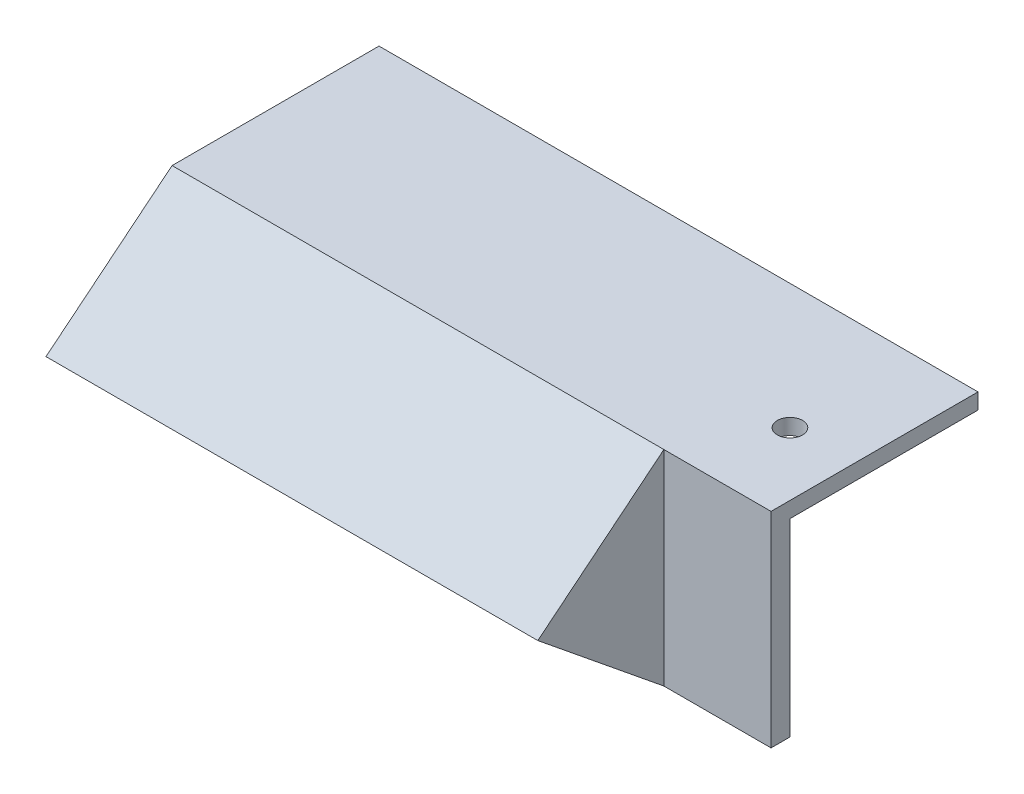
ISO-10303-21;
HEADER;
FILE_DESCRIPTION(('STEP AP214'),'2;1');
FILE_NAME('part.step','',(''),(''),'','','');
FILE_SCHEMA(('AUTOMOTIVE_DESIGN { 1 0 10303 214 1 1 1 1 }'));
ENDSEC;
DATA;
#1=APPLICATION_CONTEXT('core data for automotive mechanical design processes');
#2=APPLICATION_PROTOCOL_DEFINITION('international standard','automotive_design',2000,#1);
#3=PRODUCT_CONTEXT('',#1,'mechanical');
#4=PRODUCT('Part','Part','',(#3));
#5=PRODUCT_RELATED_PRODUCT_CATEGORY('part','',(#4));
#6=PRODUCT_DEFINITION_FORMATION('','',#4);
#7=PRODUCT_DEFINITION_CONTEXT('part definition',#1,'design');
#8=PRODUCT_DEFINITION('design','',#6,#7);
#9=PRODUCT_DEFINITION_SHAPE('','',#8);
#10=(LENGTH_UNIT() NAMED_UNIT(*) SI_UNIT(.MILLI.,.METRE.));
#11=(NAMED_UNIT(*) PLANE_ANGLE_UNIT() SI_UNIT($,.RADIAN.));
#12=(NAMED_UNIT(*) SI_UNIT($,.STERADIAN.) SOLID_ANGLE_UNIT());
#13=UNCERTAINTY_MEASURE_WITH_UNIT(LENGTH_MEASURE(1.E-05),#10,'distance_accuracy_value','');
#14=(GEOMETRIC_REPRESENTATION_CONTEXT(3) GLOBAL_UNCERTAINTY_ASSIGNED_CONTEXT((#13)) GLOBAL_UNIT_ASSIGNED_CONTEXT((#10,
#11,#12)) REPRESENTATION_CONTEXT('',''));
#15=CARTESIAN_POINT('',(0.,0.,0.));
#16=DIRECTION('',(0.,0.,1.));
#17=DIRECTION('',(1.,0.,0.));
#18=AXIS2_PLACEMENT_3D('',#15,#16,#17);
#19=CARTESIAN_POINT('',(0.,0.,91.));
#20=DIRECTION('',(0.,0.,1.));
#21=DIRECTION('',(1.,0.,0.));
#22=AXIS2_PLACEMENT_3D('',#19,#20,#21);
#23=PLANE('',#22);
#24=DIRECTION('',(0.,-1.,0.));
#25=VECTOR('',#24,1.);
#26=CARTESIAN_POINT('',(114.023739181458,-43.3,91.));
#27=LINE('',#26,#25);
#28=CARTESIAN_POINT('',(114.023739181458,-43.3,91.));
#29=VERTEX_POINT('',#28);
#30=CARTESIAN_POINT('',(114.023739181458,-45.8001,91.));
#31=VERTEX_POINT('',#30);
#32=EDGE_CURVE('E112',#29,#31,#27,.T.);
#33=ORIENTED_EDGE('',*,*,#32,.T.);
#34=DIRECTION('',(-1.,0.,0.));
#35=VECTOR('',#34,1.);
#36=CARTESIAN_POINT('',(0.,-45.8001,91.));
#37=LINE('',#36,#35);
#38=CARTESIAN_POINT('',(19.,-45.8001,91.));
#39=VERTEX_POINT('',#38);
#40=EDGE_CURVE('E142',#31,#39,#37,.T.);
#41=ORIENTED_EDGE('',*,*,#40,.T.);
#42=DIRECTION('',(0.,1.,0.));
#43=VECTOR('',#42,1.);
#44=CARTESIAN_POINT('',(19.,0.,91.));
#45=LINE('',#44,#43);
#46=CARTESIAN_POINT('',(19.,-43.3,91.));
#47=VERTEX_POINT('',#46);
#48=EDGE_CURVE('E39',#39,#47,#45,.T.);
#49=ORIENTED_EDGE('',*,*,#48,.T.);
#50=DIRECTION('',(-1.,0.,0.));
#51=VECTOR('',#50,1.);
#52=CARTESIAN_POINT('',(0.,-43.3,91.));
#53=LINE('',#52,#51);
#54=EDGE_CURVE('E108',#29,#47,#53,.T.);
#55=ORIENTED_EDGE('',*,*,#54,.F.);
#56=EDGE_LOOP('',(#33,#41,#49,#55));
#57=FACE_BOUND('',#56,.T.);
#58=ADVANCED_FACE('F35',(#57),#23,.F.);
#59=CARTESIAN_POINT('',(19.,0.,0.));
#60=DIRECTION('',(1.,0.,0.));
#61=DIRECTION('',(0.,0.,-1.));
#62=AXIS2_PLACEMENT_3D('',#59,#60,#61);
#63=PLANE('',#62);
#64=DIRECTION('',(0.,0.,1.));
#65=VECTOR('',#64,1.);
#66=CARTESIAN_POINT('',(19.,-45.8001,0.));
#67=LINE('',#66,#65);
#68=CARTESIAN_POINT('',(19.,-45.8001,120.831364888433));
#69=VERTEX_POINT('',#68);
#70=EDGE_CURVE('E141',#39,#69,#67,.T.);
#71=ORIENTED_EDGE('',*,*,#70,.T.);
#72=DIRECTION('',(0.,1.,0.));
#73=VECTOR('',#72,1.);
#74=CARTESIAN_POINT('',(19.,0.,120.831364888433));
#75=LINE('',#74,#73);
#76=CARTESIAN_POINT('',(19.,-75.8001,120.831364888433));
#77=VERTEX_POINT('',#76);
#78=EDGE_CURVE('E170',#77,#69,#75,.T.);
#79=ORIENTED_EDGE('',*,*,#78,.F.);
#80=DIRECTION('',(0.,0.,1.));
#81=VECTOR('',#80,1.);
#82=CARTESIAN_POINT('',(19.,-75.8001,123.831364888433));
#83=LINE('',#82,#81);
#84=CARTESIAN_POINT('',(19.,-75.8001,123.831364888433));
#85=VERTEX_POINT('',#84);
#86=EDGE_CURVE('E121',#77,#85,#83,.T.);
#87=ORIENTED_EDGE('',*,*,#86,.T.);
#88=DIRECTION('',(0.,-0.630593793828697,-0.776113050518241));
#89=VECTOR('',#88,1.);
#90=CARTESIAN_POINT('',(19.,-106.262866436039,86.3388446364474));
#91=LINE('',#90,#89);
#92=CARTESIAN_POINT('',(19.,-59.55005,143.831364888433));
#93=VERTEX_POINT('',#92);
#94=EDGE_CURVE('E119',#93,#85,#91,.T.);
#95=ORIENTED_EDGE('',*,*,#94,.F.);
#96=DIRECTION('',(0.,0.630593793828698,-0.776113050518241));
#97=VECTOR('',#96,1.);
#98=CARTESIAN_POINT('',(19.,-59.55005,143.831364888433));
#99=LINE('',#98,#97);
#100=CARTESIAN_POINT('',(19.,-43.3,123.831364888433));
#101=VERTEX_POINT('',#100);
#102=EDGE_CURVE('E115',#93,#101,#99,.T.);
#103=ORIENTED_EDGE('',*,*,#102,.T.);
#104=DIRECTION('',(0.,0.,1.));
#105=VECTOR('',#104,1.);
#106=CARTESIAN_POINT('',(19.,-43.3,0.));
#107=LINE('',#106,#105);
#108=EDGE_CURVE('E101',#47,#101,#107,.T.);
#109=ORIENTED_EDGE('',*,*,#108,.F.);
#110=ORIENTED_EDGE('',*,*,#48,.F.);
#111=EDGE_LOOP('',(#71,#79,#87,#95,#103,#109,#110));
#112=FACE_BOUND('',#111,.T.);
#113=ADVANCED_FACE('F117',(#112),#63,.F.);
#114=CARTESIAN_POINT('',(104.023739181458,-43.3,110.831364888433));
#115=DIRECTION('',(0.,-1.,0.));
#116=DIRECTION('',(0.,0.,-1.));
#117=AXIS2_PLACEMENT_3D('',#114,#115,#116);
#118=CYLINDRICAL_SURFACE('',#117,2.);
#119=CARTESIAN_POINT('',(104.023739181458,-43.3,110.831364888433));
#120=DIRECTION('',(0.,-1.,0.));
#121=DIRECTION('',(0.,0.,-1.));
#122=AXIS2_PLACEMENT_3D('',#119,#120,#121);
#123=CIRCLE('',#122,2.);
#124=CARTESIAN_POINT('',(104.023739181458,-43.3,108.831364888433));
#125=VERTEX_POINT('',#124);
#126=EDGE_CURVE('E139',#125,#125,#123,.T.);
#127=ORIENTED_EDGE('',*,*,#126,.F.);
#128=EDGE_LOOP('',(#127));
#129=FACE_BOUND('',#128,.T.);
#130=CARTESIAN_POINT('',(104.023739181458,-45.8001,110.831364888433));
#131=DIRECTION('',(0.,-1.,0.));
#132=DIRECTION('',(0.,0.,-1.));
#133=AXIS2_PLACEMENT_3D('',#130,#131,#132);
#134=CIRCLE('',#133,2.);
#135=CARTESIAN_POINT('',(104.023739181458,-45.8001,108.831364888433));
#136=VERTEX_POINT('',#135);
#137=EDGE_CURVE('E138',#136,#136,#134,.T.);
#138=ORIENTED_EDGE('',*,*,#137,.T.);
#139=EDGE_LOOP('',(#138));
#140=FACE_BOUND('',#139,.T.);
#141=ADVANCED_FACE('F208',(#129,#140),#118,.F.);
#142=CARTESIAN_POINT('',(0.,0.,123.831364888433));
#143=DIRECTION('',(0.,0.,1.));
#144=DIRECTION('',(1.,0.,0.));
#145=AXIS2_PLACEMENT_3D('',#142,#143,#144);
#146=PLANE('',#145);
#147=DIRECTION('',(0.,1.,0.));
#148=VECTOR('',#147,1.);
#149=CARTESIAN_POINT('',(97.0237391814581,-48.3,123.831364888433));
#150=LINE('',#149,#148);
#151=CARTESIAN_POINT('',(97.0237391814581,-75.8001,123.831364888433));
#152=VERTEX_POINT('',#151);
#153=CARTESIAN_POINT('',(97.0237391814581,-43.3,123.831364888433));
#154=VERTEX_POINT('',#153);
#155=EDGE_CURVE('E126',#152,#154,#150,.T.);
#156=ORIENTED_EDGE('',*,*,#155,.F.);
#157=DIRECTION('',(-1.,0.,0.));
#158=VECTOR('',#157,1.);
#159=CARTESIAN_POINT('',(0.,-75.8001,123.831364888433));
#160=LINE('',#159,#158);
#161=CARTESIAN_POINT('',(114.023739181458,-75.8001,123.831364888433));
#162=VERTEX_POINT('',#161);
#163=EDGE_CURVE('E154',#162,#152,#160,.T.);
#164=ORIENTED_EDGE('',*,*,#163,.F.);
#165=DIRECTION('',(0.,-1.,0.));
#166=VECTOR('',#165,1.);
#167=CARTESIAN_POINT('',(114.023739181458,0.,123.831364888433));
#168=LINE('',#167,#166);
#169=CARTESIAN_POINT('',(114.023739181458,-43.3,123.831364888433));
#170=VERTEX_POINT('',#169);
#171=EDGE_CURVE('E153',#170,#162,#168,.T.);
#172=ORIENTED_EDGE('',*,*,#171,.F.);
#173=DIRECTION('',(-1.,0.,0.));
#174=VECTOR('',#173,1.);
#175=CARTESIAN_POINT('',(0.,-43.3,123.831364888433));
#176=LINE('',#175,#174);
#177=EDGE_CURVE('E152',#170,#154,#176,.T.);
#178=ORIENTED_EDGE('',*,*,#177,.T.);
#179=EDGE_LOOP('',(#156,#164,#172,#178));
#180=FACE_BOUND('',#179,.T.);
#181=ADVANCED_FACE('F37',(#180),#146,.T.);
#182=CARTESIAN_POINT('',(114.023739181458,-43.3,0.));
#183=DIRECTION('',(1.,0.,0.));
#184=DIRECTION('',(0.,0.,-1.));
#185=AXIS2_PLACEMENT_3D('',#182,#183,#184);
#186=PLANE('',#185);
#187=ORIENTED_EDGE('',*,*,#32,.F.);
#188=DIRECTION('',(0.,0.,1.));
#189=VECTOR('',#188,1.);
#190=CARTESIAN_POINT('',(114.023739181458,-43.3,0.));
#191=LINE('',#190,#189);
#192=EDGE_CURVE('E136',#29,#170,#191,.T.);
#193=ORIENTED_EDGE('',*,*,#192,.T.);
#194=ORIENTED_EDGE('',*,*,#171,.T.);
#195=DIRECTION('',(0.,0.,-1.));
#196=VECTOR('',#195,1.);
#197=CARTESIAN_POINT('',(114.023739181458,-75.8001,123.831364888433));
#198=LINE('',#197,#196);
#199=CARTESIAN_POINT('',(114.023739181458,-75.8001,120.831364888433));
#200=VERTEX_POINT('',#199);
#201=EDGE_CURVE('E134',#162,#200,#198,.T.);
#202=ORIENTED_EDGE('',*,*,#201,.T.);
#203=DIRECTION('',(0.,-1.,0.));
#204=VECTOR('',#203,1.);
#205=CARTESIAN_POINT('',(114.023739181458,0.,120.831364888433));
#206=LINE('',#205,#204);
#207=CARTESIAN_POINT('',(114.023739181458,-45.8001,120.831364888433));
#208=VERTEX_POINT('',#207);
#209=EDGE_CURVE('E156',#208,#200,#206,.T.);
#210=ORIENTED_EDGE('',*,*,#209,.F.);
#211=DIRECTION('',(0.,0.,1.));
#212=VECTOR('',#211,1.);
#213=CARTESIAN_POINT('',(114.023739181458,-45.8001,0.));
#214=LINE('',#213,#212);
#215=EDGE_CURVE('E132',#31,#208,#214,.T.);
#216=ORIENTED_EDGE('',*,*,#215,.F.);
#217=EDGE_LOOP('',(#187,#193,#194,#202,#210,#216));
#218=FACE_BOUND('',#217,.T.);
#219=ADVANCED_FACE('F182',(#218),#186,.T.);
#220=CARTESIAN_POINT('',(0.,-45.8001,0.));
#221=DIRECTION('',(0.,-1.,0.));
#222=DIRECTION('',(0.,0.,-1.));
#223=AXIS2_PLACEMENT_3D('',#220,#221,#222);
#224=PLANE('',#223);
#225=ORIENTED_EDGE('',*,*,#70,.F.);
#226=ORIENTED_EDGE('',*,*,#40,.F.);
#227=ORIENTED_EDGE('',*,*,#215,.T.);
#228=DIRECTION('',(-1.,0.,0.));
#229=VECTOR('',#228,1.);
#230=CARTESIAN_POINT('',(0.,-45.8001,120.831364888433));
#231=LINE('',#230,#229);
#232=EDGE_CURVE('E135',#208,#69,#231,.T.);
#233=ORIENTED_EDGE('',*,*,#232,.T.);
#234=EDGE_LOOP('',(#225,#226,#227,#233));
#235=FACE_BOUND('',#234,.T.);
#236=ORIENTED_EDGE('',*,*,#137,.F.);
#237=EDGE_LOOP('',(#236));
#238=FACE_BOUND('',#237,.T.);
#239=ADVANCED_FACE('F188',(#235,#238),#224,.T.);
#240=CARTESIAN_POINT('',(0.,-43.3,0.));
#241=DIRECTION('',(0.,-1.,0.));
#242=DIRECTION('',(0.,0.,-1.));
#243=AXIS2_PLACEMENT_3D('',#240,#241,#242);
#244=PLANE('',#243);
#245=ORIENTED_EDGE('',*,*,#126,.T.);
#246=EDGE_LOOP('',(#245));
#247=FACE_BOUND('',#246,.T.);
#248=ORIENTED_EDGE('',*,*,#54,.T.);
#249=ORIENTED_EDGE('',*,*,#108,.T.);
#250=DIRECTION('',(-1.,0.,0.));
#251=VECTOR('',#250,1.);
#252=CARTESIAN_POINT('',(114.023739181458,-43.3,123.831364888433));
#253=LINE('',#252,#251);
#254=EDGE_CURVE('E105',#154,#101,#253,.T.);
#255=ORIENTED_EDGE('',*,*,#254,.F.);
#256=ORIENTED_EDGE('',*,*,#177,.F.);
#257=ORIENTED_EDGE('',*,*,#192,.F.);
#258=EDGE_LOOP('',(#248,#249,#255,#256,#257));
#259=FACE_BOUND('',#258,.T.);
#260=ADVANCED_FACE('F103',(#247,#259),#244,.F.);
#261=CARTESIAN_POINT('',(97.0237391814581,-48.3,143.831364888433));
#262=DIRECTION('',(-1.,0.,0.));
#263=DIRECTION('',(0.,0.,1.));
#264=AXIS2_PLACEMENT_3D('',#261,#262,#263);
#265=PLANE('',#264);
#266=DIRECTION('',(0.,0.630593793828698,-0.776113050518241));
#267=VECTOR('',#266,1.);
#268=CARTESIAN_POINT('',(97.0237391814581,-55.0764841234016,138.325454596958));
#269=LINE('',#268,#267);
#270=CARTESIAN_POINT('',(97.0237391814581,-59.55005,143.831364888433));
#271=VERTEX_POINT('',#270);
#272=EDGE_CURVE('E58',#271,#154,#269,.T.);
#273=ORIENTED_EDGE('',*,*,#272,.F.);
#274=DIRECTION('',(0.,-0.630593793828697,-0.776113050518241));
#275=VECTOR('',#274,1.);
#276=CARTESIAN_POINT('',(97.0237391814581,-55.0764841234016,149.337275179907));
#277=LINE('',#276,#275);
#278=EDGE_CURVE('E44',#271,#152,#277,.T.);
#279=ORIENTED_EDGE('',*,*,#278,.T.);
#280=ORIENTED_EDGE('',*,*,#155,.T.);
#281=EDGE_LOOP('',(#273,#279,#280));
#282=FACE_BOUND('',#281,.T.);
#283=ADVANCED_FACE('F193',(#282),#265,.F.);
#284=CARTESIAN_POINT('',(0.,-75.8001,123.831364888433));
#285=DIRECTION('',(0.,-1.,0.));
#286=DIRECTION('',(0.,0.,-1.));
#287=AXIS2_PLACEMENT_3D('',#284,#285,#286);
#288=PLANE('',#287);
#289=ORIENTED_EDGE('',*,*,#86,.F.);
#290=DIRECTION('',(-1.,0.,0.));
#291=VECTOR('',#290,1.);
#292=CARTESIAN_POINT('',(0.,-75.8001,120.831364888433));
#293=LINE('',#292,#291);
#294=EDGE_CURVE('E129',#200,#77,#293,.T.);
#295=ORIENTED_EDGE('',*,*,#294,.F.);
#296=ORIENTED_EDGE('',*,*,#201,.F.);
#297=ORIENTED_EDGE('',*,*,#163,.T.);
#298=DIRECTION('',(-1.,0.,0.));
#299=VECTOR('',#298,1.);
#300=CARTESIAN_POINT('',(114.023739181458,-75.8001,123.831364888433));
#301=LINE('',#300,#299);
#302=EDGE_CURVE('E11',#152,#85,#301,.T.);
#303=ORIENTED_EDGE('',*,*,#302,.T.);
#304=EDGE_LOOP('',(#289,#295,#296,#297,#303));
#305=FACE_BOUND('',#304,.T.);
#306=ADVANCED_FACE('F184',(#305),#288,.T.);
#307=CARTESIAN_POINT('',(114.023739181458,-59.55005,143.831364888433));
#308=DIRECTION('',(0.,0.776113050518241,0.630593793828698));
#309=DIRECTION('',(0.,-0.630593793828698,0.776113050518241));
#310=AXIS2_PLACEMENT_3D('',#307,#308,#309);
#311=PLANE('',#310);
#312=ORIENTED_EDGE('',*,*,#102,.F.);
#313=DIRECTION('',(-1.,0.,0.));
#314=VECTOR('',#313,1.);
#315=CARTESIAN_POINT('',(0.,-59.55005,143.831364888433));
#316=LINE('',#315,#314);
#317=EDGE_CURVE('E148',#271,#93,#316,.T.);
#318=ORIENTED_EDGE('',*,*,#317,.F.);
#319=ORIENTED_EDGE('',*,*,#272,.T.);
#320=ORIENTED_EDGE('',*,*,#254,.T.);
#321=EDGE_LOOP('',(#312,#318,#319,#320));
#322=FACE_BOUND('',#321,.T.);
#323=ADVANCED_FACE('F123',(#322),#311,.T.);
#324=CARTESIAN_POINT('',(114.023739181458,-106.262866436039,86.3388446364474));
#325=DIRECTION('',(0.,0.776113050518241,-0.630593793828697));
#326=DIRECTION('',(0.,0.630593793828697,0.776113050518241));
#327=AXIS2_PLACEMENT_3D('',#324,#325,#326);
#328=PLANE('',#327);
#329=ORIENTED_EDGE('',*,*,#317,.T.);
#330=ORIENTED_EDGE('',*,*,#94,.T.);
#331=ORIENTED_EDGE('',*,*,#302,.F.);
#332=ORIENTED_EDGE('',*,*,#278,.F.);
#333=EDGE_LOOP('',(#329,#330,#331,#332));
#334=FACE_BOUND('',#333,.T.);
#335=ADVANCED_FACE('F194',(#334),#328,.F.);
#336=CARTESIAN_POINT('',(0.,0.,120.831364888433));
#337=DIRECTION('',(0.,0.,1.));
#338=DIRECTION('',(1.,0.,0.));
#339=AXIS2_PLACEMENT_3D('',#336,#337,#338);
#340=PLANE('',#339);
#341=ORIENTED_EDGE('',*,*,#294,.T.);
#342=ORIENTED_EDGE('',*,*,#78,.T.);
#343=ORIENTED_EDGE('',*,*,#232,.F.);
#344=ORIENTED_EDGE('',*,*,#209,.T.);
#345=EDGE_LOOP('',(#341,#342,#343,#344));
#346=FACE_BOUND('',#345,.T.);
#347=ADVANCED_FACE('F185',(#346),#340,.F.);
#348=CLOSED_SHELL('',(#58,#113,#141,#181,#219,#239,#260,#283,#306,#323,#335,#347));
#349=MANIFOLD_SOLID_BREP('B2',#348);
#350=ADVANCED_BREP_SHAPE_REPRESENTATION('',(#18,#349),#14);
#351=SHAPE_DEFINITION_REPRESENTATION(#9,#350);
ENDSEC;
END-ISO-10303-21;
